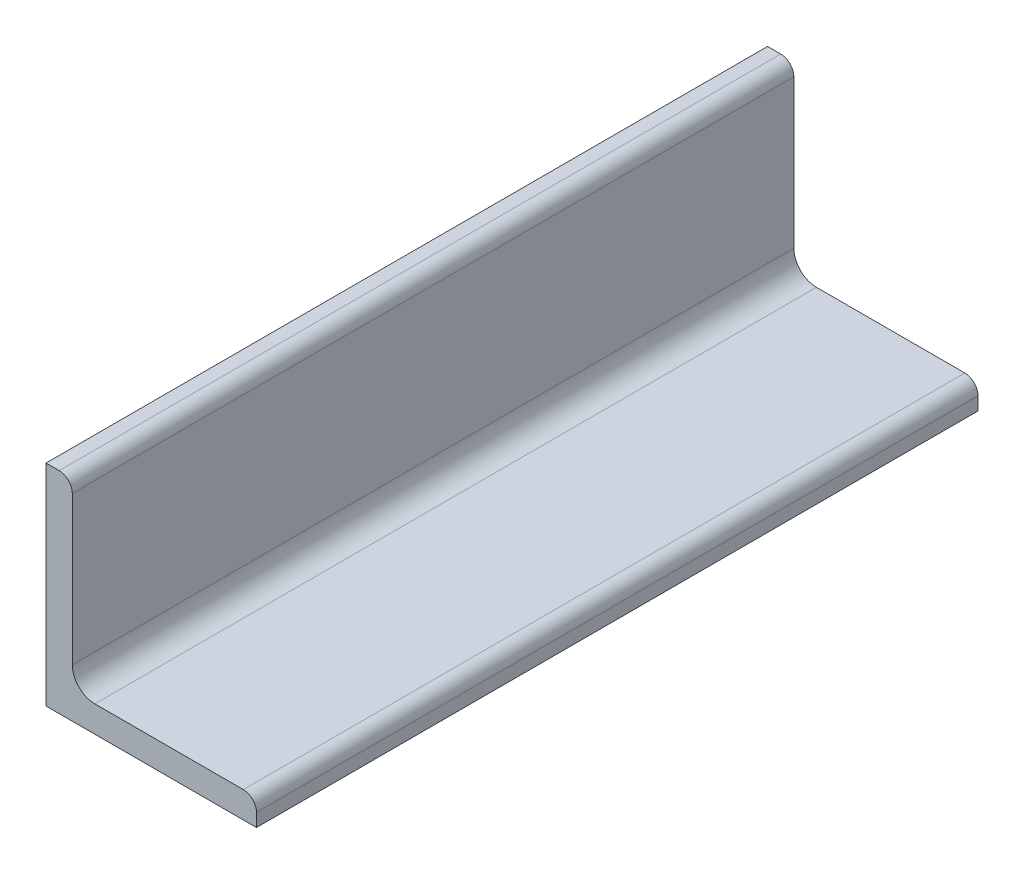
ISO-10303-21;
HEADER;
FILE_DESCRIPTION(('STEP AP214'),'2;1');
FILE_NAME('part.step','',(''),(''),'','','');
FILE_SCHEMA(('AUTOMOTIVE_DESIGN { 1 0 10303 214 1 1 1 1 }'));
ENDSEC;
DATA;
#1=APPLICATION_CONTEXT('core data for automotive mechanical design processes');
#2=APPLICATION_PROTOCOL_DEFINITION('international standard','automotive_design',2000,#1);
#3=PRODUCT_CONTEXT('',#1,'mechanical');
#4=PRODUCT('Part','Part','',(#3));
#5=PRODUCT_RELATED_PRODUCT_CATEGORY('part','',(#4));
#6=PRODUCT_DEFINITION_FORMATION('','',#4);
#7=PRODUCT_DEFINITION_CONTEXT('part definition',#1,'design');
#8=PRODUCT_DEFINITION('design','',#6,#7);
#9=PRODUCT_DEFINITION_SHAPE('','',#8);
#10=(LENGTH_UNIT() NAMED_UNIT(*) SI_UNIT(.MILLI.,.METRE.));
#11=(NAMED_UNIT(*) PLANE_ANGLE_UNIT() SI_UNIT($,.RADIAN.));
#12=(NAMED_UNIT(*) SI_UNIT($,.STERADIAN.) SOLID_ANGLE_UNIT());
#13=UNCERTAINTY_MEASURE_WITH_UNIT(LENGTH_MEASURE(1.E-05),#10,'distance_accuracy_value','');
#14=(GEOMETRIC_REPRESENTATION_CONTEXT(3) GLOBAL_UNCERTAINTY_ASSIGNED_CONTEXT((#13)) GLOBAL_UNIT_ASSIGNED_CONTEXT((#10,
#11,#12)) REPRESENTATION_CONTEXT('',''));
#15=CARTESIAN_POINT('',(0.,0.,0.));
#16=DIRECTION('',(0.,0.,1.));
#17=DIRECTION('',(1.,0.,0.));
#18=AXIS2_PLACEMENT_3D('',#15,#16,#17);
#19=CARTESIAN_POINT('',(0.0836264027816469,89.7372005393545,304.8));
#20=DIRECTION('',(1.,0.,0.));
#21=DIRECTION('',(0.,0.,-1.));
#22=AXIS2_PLACEMENT_3D('',#19,#20,#21);
#23=PLANE('',#22);
#24=DIRECTION('',(0.,-1.,0.));
#25=VECTOR('',#24,1.);
#26=CARTESIAN_POINT('',(0.0836264027816469,89.7372005393545,0.));
#27=LINE('',#26,#25);
#28=CARTESIAN_POINT('',(0.0836264027816469,89.7372005393545,0.));
#29=VERTEX_POINT('',#28);
#30=CARTESIAN_POINT('',(0.0836264027816469,0.837200539354535,0.));
#31=VERTEX_POINT('',#30);
#32=EDGE_CURVE('E135',#29,#31,#27,.T.);
#33=ORIENTED_EDGE('',*,*,#32,.T.);
#34=DIRECTION('',(0.,0.,-1.));
#35=VECTOR('',#34,1.);
#36=CARTESIAN_POINT('',(0.0836264027816469,0.837200539354535,304.8));
#37=LINE('',#36,#35);
#38=CARTESIAN_POINT('',(0.0836264027816469,0.837200539354535,304.8));
#39=VERTEX_POINT('',#38);
#40=EDGE_CURVE('E11',#39,#31,#37,.T.);
#41=ORIENTED_EDGE('',*,*,#40,.F.);
#42=DIRECTION('',(0.,-1.,0.));
#43=VECTOR('',#42,1.);
#44=CARTESIAN_POINT('',(0.0836264027816469,89.7372005393545,304.8));
#45=LINE('',#44,#43);
#46=CARTESIAN_POINT('',(0.0836264027816469,89.7372005393545,304.8));
#47=VERTEX_POINT('',#46);
#48=EDGE_CURVE('E151',#47,#39,#45,.T.);
#49=ORIENTED_EDGE('',*,*,#48,.F.);
#50=DIRECTION('',(0.,0.,-1.));
#51=VECTOR('',#50,1.);
#52=CARTESIAN_POINT('',(0.0836264027816469,89.7372005393545,304.8));
#53=LINE('',#52,#51);
#54=EDGE_CURVE('E131',#47,#29,#53,.T.);
#55=ORIENTED_EDGE('',*,*,#54,.T.);
#56=EDGE_LOOP('',(#33,#41,#49,#55));
#57=FACE_BOUND('',#56,.T.);
#58=ADVANCED_FACE('F33',(#57),#23,.F.);
#59=CARTESIAN_POINT('',(0.0836264027816469,0.837200539354535,304.8));
#60=DIRECTION('',(0.,1.,0.));
#61=DIRECTION('',(0.,0.,1.));
#62=AXIS2_PLACEMENT_3D('',#59,#60,#61);
#63=PLANE('',#62);
#64=DIRECTION('',(1.,0.,0.));
#65=VECTOR('',#64,1.);
#66=CARTESIAN_POINT('',(0.0836264027816469,0.837200539354535,0.));
#67=LINE('',#66,#65);
#68=CARTESIAN_POINT('',(88.9836264027817,0.837200539354535,0.));
#69=VERTEX_POINT('',#68);
#70=EDGE_CURVE('E138',#31,#69,#67,.T.);
#71=ORIENTED_EDGE('',*,*,#70,.T.);
#72=DIRECTION('',(0.,0.,-1.));
#73=VECTOR('',#72,1.);
#74=CARTESIAN_POINT('',(88.9836264027817,0.837200539354535,304.8));
#75=LINE('',#74,#73);
#76=CARTESIAN_POINT('',(88.9836264027817,0.837200539354535,304.8));
#77=VERTEX_POINT('',#76);
#78=EDGE_CURVE('E41',#77,#69,#75,.T.);
#79=ORIENTED_EDGE('',*,*,#78,.F.);
#80=DIRECTION('',(1.,0.,0.));
#81=VECTOR('',#80,1.);
#82=CARTESIAN_POINT('',(0.0836264027816469,0.837200539354535,304.8));
#83=LINE('',#82,#81);
#84=EDGE_CURVE('E95',#39,#77,#83,.T.);
#85=ORIENTED_EDGE('',*,*,#84,.F.);
#86=ORIENTED_EDGE('',*,*,#40,.T.);
#87=EDGE_LOOP('',(#71,#79,#85,#86));
#88=FACE_BOUND('',#87,.T.);
#89=ADVANCED_FACE('F194',(#88),#63,.F.);
#90=CARTESIAN_POINT('',(88.9836264027817,0.837200539354535,304.8));
#91=DIRECTION('',(-1.,0.,0.));
#92=DIRECTION('',(0.,0.,1.));
#93=AXIS2_PLACEMENT_3D('',#90,#91,#92);
#94=PLANE('',#93);
#95=DIRECTION('',(0.,1.,0.));
#96=VECTOR('',#95,1.);
#97=CARTESIAN_POINT('',(88.9836264027817,0.837200539354535,0.));
#98=LINE('',#97,#96);
#99=CARTESIAN_POINT('',(88.9836264027817,6.39345053935453,0.));
#100=VERTEX_POINT('',#99);
#101=EDGE_CURVE('E140',#69,#100,#98,.T.);
#102=ORIENTED_EDGE('',*,*,#101,.T.);
#103=DIRECTION('',(0.,0.,-1.));
#104=VECTOR('',#103,1.);
#105=CARTESIAN_POINT('',(88.9836264027817,6.39345053935453,304.8));
#106=LINE('',#105,#104);
#107=CARTESIAN_POINT('',(88.9836264027817,6.39345053935453,304.8));
#108=VERTEX_POINT('',#107);
#109=EDGE_CURVE('E161',#108,#100,#106,.T.);
#110=ORIENTED_EDGE('',*,*,#109,.F.);
#111=DIRECTION('',(0.,1.,0.));
#112=VECTOR('',#111,1.);
#113=CARTESIAN_POINT('',(88.9836264027817,0.837200539354535,304.8));
#114=LINE('',#113,#112);
#115=EDGE_CURVE('E169',#77,#108,#114,.T.);
#116=ORIENTED_EDGE('',*,*,#115,.F.);
#117=ORIENTED_EDGE('',*,*,#78,.T.);
#118=EDGE_LOOP('',(#102,#110,#116,#117));
#119=FACE_BOUND('',#118,.T.);
#120=ADVANCED_FACE('F167',(#119),#94,.F.);
#121=CARTESIAN_POINT('',(83.4273764027816,6.39345053935453,304.8));
#122=DIRECTION('',(0.,0.,-1.));
#123=DIRECTION('',(-1.,0.,0.));
#124=AXIS2_PLACEMENT_3D('',#121,#122,#123);
#125=CYLINDRICAL_SURFACE('',#124,5.55625000000001);
#126=CARTESIAN_POINT('',(83.4273764027816,6.39345053935453,0.));
#127=DIRECTION('',(0.,0.,1.));
#128=DIRECTION('',(1.,0.,0.));
#129=AXIS2_PLACEMENT_3D('',#126,#127,#128);
#130=CIRCLE('',#129,5.55625000000001);
#131=CARTESIAN_POINT('',(83.4273764027816,11.9497005393545,0.));
#132=VERTEX_POINT('',#131);
#133=EDGE_CURVE('E142',#100,#132,#130,.T.);
#134=ORIENTED_EDGE('',*,*,#133,.T.);
#135=DIRECTION('',(0.,0.,-1.));
#136=VECTOR('',#135,1.);
#137=CARTESIAN_POINT('',(83.4273764027816,11.9497005393545,304.8));
#138=LINE('',#137,#136);
#139=CARTESIAN_POINT('',(83.4273764027816,11.9497005393545,304.8));
#140=VERTEX_POINT('',#139);
#141=EDGE_CURVE('E158',#140,#132,#138,.T.);
#142=ORIENTED_EDGE('',*,*,#141,.F.);
#143=CARTESIAN_POINT('',(83.4273764027816,6.39345053935453,304.8));
#144=DIRECTION('',(0.,0.,1.));
#145=DIRECTION('',(1.,0.,0.));
#146=AXIS2_PLACEMENT_3D('',#143,#144,#145);
#147=CIRCLE('',#146,5.55625000000001);
#148=EDGE_CURVE('E185',#108,#140,#147,.T.);
#149=ORIENTED_EDGE('',*,*,#148,.F.);
#150=ORIENTED_EDGE('',*,*,#109,.T.);
#151=EDGE_LOOP('',(#134,#142,#149,#150));
#152=FACE_BOUND('',#151,.T.);
#153=ADVANCED_FACE('F178',(#152),#125,.T.);
#154=CARTESIAN_POINT('',(83.4273764027816,11.9497005393545,304.8));
#155=DIRECTION('',(0.,-1.,0.));
#156=DIRECTION('',(0.,0.,-1.));
#157=AXIS2_PLACEMENT_3D('',#154,#155,#156);
#158=PLANE('',#157);
#159=DIRECTION('',(-1.,0.,0.));
#160=VECTOR('',#159,1.);
#161=CARTESIAN_POINT('',(83.4273764027816,11.9497005393545,0.));
#162=LINE('',#161,#160);
#163=CARTESIAN_POINT('',(20.7211264027816,11.9497005393545,0.));
#164=VERTEX_POINT('',#163);
#165=EDGE_CURVE('E144',#132,#164,#162,.T.);
#166=ORIENTED_EDGE('',*,*,#165,.T.);
#167=DIRECTION('',(0.,0.,-1.));
#168=VECTOR('',#167,1.);
#169=CARTESIAN_POINT('',(20.7211264027816,11.9497005393545,304.8));
#170=LINE('',#169,#168);
#171=CARTESIAN_POINT('',(20.7211264027816,11.9497005393545,304.8));
#172=VERTEX_POINT('',#171);
#173=EDGE_CURVE('E155',#172,#164,#170,.T.);
#174=ORIENTED_EDGE('',*,*,#173,.F.);
#175=DIRECTION('',(-1.,0.,0.));
#176=VECTOR('',#175,1.);
#177=CARTESIAN_POINT('',(83.4273764027816,11.9497005393545,304.8));
#178=LINE('',#177,#176);
#179=EDGE_CURVE('E184',#140,#172,#178,.T.);
#180=ORIENTED_EDGE('',*,*,#179,.F.);
#181=ORIENTED_EDGE('',*,*,#141,.T.);
#182=EDGE_LOOP('',(#166,#174,#180,#181));
#183=FACE_BOUND('',#182,.T.);
#184=ADVANCED_FACE('F182',(#183),#158,.F.);
#185=CARTESIAN_POINT('',(20.7211264027816,21.4747005393545,304.8));
#186=DIRECTION('',(0.,0.,-1.));
#187=DIRECTION('',(-1.,0.,0.));
#188=AXIS2_PLACEMENT_3D('',#185,#186,#187);
#189=CYLINDRICAL_SURFACE('',#188,9.52499999999999);
#190=CARTESIAN_POINT('',(20.7211264027816,21.4747005393545,0.));
#191=DIRECTION('',(0.,0.,-1.));
#192=DIRECTION('',(1.,0.,0.));
#193=AXIS2_PLACEMENT_3D('',#190,#191,#192);
#194=CIRCLE('',#193,9.52499999999999);
#195=CARTESIAN_POINT('',(11.1961264027816,21.4747005393545,0.));
#196=VERTEX_POINT('',#195);
#197=EDGE_CURVE('E146',#164,#196,#194,.T.);
#198=ORIENTED_EDGE('',*,*,#197,.T.);
#199=DIRECTION('',(0.,0.,-1.));
#200=VECTOR('',#199,1.);
#201=CARTESIAN_POINT('',(11.1961264027816,21.4747005393545,304.8));
#202=LINE('',#201,#200);
#203=CARTESIAN_POINT('',(11.1961264027816,21.4747005393545,304.8));
#204=VERTEX_POINT('',#203);
#205=EDGE_CURVE('E126',#204,#196,#202,.T.);
#206=ORIENTED_EDGE('',*,*,#205,.F.);
#207=CARTESIAN_POINT('',(20.7211264027816,21.4747005393545,304.8));
#208=DIRECTION('',(0.,0.,-1.));
#209=DIRECTION('',(1.,0.,0.));
#210=AXIS2_PLACEMENT_3D('',#207,#208,#209);
#211=CIRCLE('',#210,9.52499999999999);
#212=EDGE_CURVE('E117',#172,#204,#211,.T.);
#213=ORIENTED_EDGE('',*,*,#212,.F.);
#214=ORIENTED_EDGE('',*,*,#173,.T.);
#215=EDGE_LOOP('',(#198,#206,#213,#214));
#216=FACE_BOUND('',#215,.T.);
#217=ADVANCED_FACE('F206',(#216),#189,.F.);
#218=CARTESIAN_POINT('',(11.1961264027816,21.4747005393545,304.8));
#219=DIRECTION('',(-1.,0.,0.));
#220=DIRECTION('',(0.,0.,1.));
#221=AXIS2_PLACEMENT_3D('',#218,#219,#220);
#222=PLANE('',#221);
#223=DIRECTION('',(0.,1.,0.));
#224=VECTOR('',#223,1.);
#225=CARTESIAN_POINT('',(11.1961264027816,21.4747005393545,0.));
#226=LINE('',#225,#224);
#227=CARTESIAN_POINT('',(11.1961264027816,84.1809505393545,0.));
#228=VERTEX_POINT('',#227);
#229=EDGE_CURVE('E125',#196,#228,#226,.T.);
#230=ORIENTED_EDGE('',*,*,#229,.T.);
#231=DIRECTION('',(0.,0.,-1.));
#232=VECTOR('',#231,1.);
#233=CARTESIAN_POINT('',(11.1961264027816,84.1809505393545,304.8));
#234=LINE('',#233,#232);
#235=CARTESIAN_POINT('',(11.1961264027816,84.1809505393545,304.8));
#236=VERTEX_POINT('',#235);
#237=EDGE_CURVE('E122',#236,#228,#234,.T.);
#238=ORIENTED_EDGE('',*,*,#237,.F.);
#239=DIRECTION('',(0.,1.,0.));
#240=VECTOR('',#239,1.);
#241=CARTESIAN_POINT('',(11.1961264027816,21.4747005393545,304.8));
#242=LINE('',#241,#240);
#243=EDGE_CURVE('E111',#204,#236,#242,.T.);
#244=ORIENTED_EDGE('',*,*,#243,.F.);
#245=ORIENTED_EDGE('',*,*,#205,.T.);
#246=EDGE_LOOP('',(#230,#238,#244,#245));
#247=FACE_BOUND('',#246,.T.);
#248=ADVANCED_FACE('F123',(#247),#222,.F.);
#249=CARTESIAN_POINT('',(5.63987640278164,84.1809505393545,304.8));
#250=DIRECTION('',(0.,0.,-1.));
#251=DIRECTION('',(-1.,0.,0.));
#252=AXIS2_PLACEMENT_3D('',#249,#250,#251);
#253=CYLINDRICAL_SURFACE('',#252,5.55625000000001);
#254=CARTESIAN_POINT('',(5.63987640278164,84.1809505393545,0.));
#255=DIRECTION('',(0.,0.,1.));
#256=DIRECTION('',(1.,0.,0.));
#257=AXIS2_PLACEMENT_3D('',#254,#255,#256);
#258=CIRCLE('',#257,5.55625000000001);
#259=CARTESIAN_POINT('',(5.63987640278165,89.7372005393545,0.));
#260=VERTEX_POINT('',#259);
#261=EDGE_CURVE('E81',#228,#260,#258,.T.);
#262=ORIENTED_EDGE('',*,*,#261,.T.);
#263=DIRECTION('',(0.,0.,-1.));
#264=VECTOR('',#263,1.);
#265=CARTESIAN_POINT('',(5.63987640278165,89.7372005393545,304.8));
#266=LINE('',#265,#264);
#267=CARTESIAN_POINT('',(5.63987640278165,89.7372005393545,304.8));
#268=VERTEX_POINT('',#267);
#269=EDGE_CURVE('E127',#268,#260,#266,.T.);
#270=ORIENTED_EDGE('',*,*,#269,.F.);
#271=CARTESIAN_POINT('',(5.63987640278164,84.1809505393545,304.8));
#272=DIRECTION('',(0.,0.,1.));
#273=DIRECTION('',(1.,0.,0.));
#274=AXIS2_PLACEMENT_3D('',#271,#272,#273);
#275=CIRCLE('',#274,5.55625000000001);
#276=EDGE_CURVE('E115',#236,#268,#275,.T.);
#277=ORIENTED_EDGE('',*,*,#276,.F.);
#278=ORIENTED_EDGE('',*,*,#237,.T.);
#279=EDGE_LOOP('',(#262,#270,#277,#278));
#280=FACE_BOUND('',#279,.T.);
#281=ADVANCED_FACE('F129',(#280),#253,.T.);
#282=CARTESIAN_POINT('',(5.63987640278165,89.7372005393545,304.8));
#283=DIRECTION('',(0.,-1.,0.));
#284=DIRECTION('',(0.,0.,-1.));
#285=AXIS2_PLACEMENT_3D('',#282,#283,#284);
#286=PLANE('',#285);
#287=DIRECTION('',(-1.,0.,0.));
#288=VECTOR('',#287,1.);
#289=CARTESIAN_POINT('',(5.63987640278165,89.7372005393545,0.));
#290=LINE('',#289,#288);
#291=EDGE_CURVE('E87',#260,#29,#290,.T.);
#292=ORIENTED_EDGE('',*,*,#291,.T.);
#293=ORIENTED_EDGE('',*,*,#54,.F.);
#294=DIRECTION('',(-1.,0.,0.));
#295=VECTOR('',#294,1.);
#296=CARTESIAN_POINT('',(5.63987640278165,89.7372005393545,304.8));
#297=LINE('',#296,#295);
#298=EDGE_CURVE('E49',#268,#47,#297,.T.);
#299=ORIENTED_EDGE('',*,*,#298,.F.);
#300=ORIENTED_EDGE('',*,*,#269,.T.);
#301=EDGE_LOOP('',(#292,#293,#299,#300));
#302=FACE_BOUND('',#301,.T.);
#303=ADVANCED_FACE('F214',(#302),#286,.F.);
#304=CARTESIAN_POINT('',(83.4273764027816,6.39345053935453,304.8));
#305=DIRECTION('',(0.,0.,1.));
#306=DIRECTION('',(1.,0.,0.));
#307=AXIS2_PLACEMENT_3D('',#304,#305,#306);
#308=PLANE('',#307);
#309=ORIENTED_EDGE('',*,*,#48,.T.);
#310=ORIENTED_EDGE('',*,*,#84,.T.);
#311=ORIENTED_EDGE('',*,*,#115,.T.);
#312=ORIENTED_EDGE('',*,*,#148,.T.);
#313=ORIENTED_EDGE('',*,*,#179,.T.);
#314=ORIENTED_EDGE('',*,*,#212,.T.);
#315=ORIENTED_EDGE('',*,*,#243,.T.);
#316=ORIENTED_EDGE('',*,*,#276,.T.);
#317=ORIENTED_EDGE('',*,*,#298,.T.);
#318=EDGE_LOOP('',(#309,#310,#311,#312,#313,#314,#315,#316,#317));
#319=FACE_BOUND('',#318,.T.);
#320=ADVANCED_FACE('F113',(#319),#308,.T.);
#321=CARTESIAN_POINT('',(83.4273764027816,6.39345053935453,0.));
#322=DIRECTION('',(0.,0.,1.));
#323=DIRECTION('',(1.,0.,0.));
#324=AXIS2_PLACEMENT_3D('',#321,#322,#323);
#325=PLANE('',#324);
#326=ORIENTED_EDGE('',*,*,#32,.F.);
#327=ORIENTED_EDGE('',*,*,#291,.F.);
#328=ORIENTED_EDGE('',*,*,#261,.F.);
#329=ORIENTED_EDGE('',*,*,#229,.F.);
#330=ORIENTED_EDGE('',*,*,#197,.F.);
#331=ORIENTED_EDGE('',*,*,#165,.F.);
#332=ORIENTED_EDGE('',*,*,#133,.F.);
#333=ORIENTED_EDGE('',*,*,#101,.F.);
#334=ORIENTED_EDGE('',*,*,#70,.F.);
#335=EDGE_LOOP('',(#326,#327,#328,#329,#330,#331,#332,#333,#334));
#336=FACE_BOUND('',#335,.T.);
#337=ADVANCED_FACE('F173',(#336),#325,.F.);
#338=CLOSED_SHELL('',(#58,#89,#120,#153,#184,#217,#248,#281,#303,#320,#337));
#339=MANIFOLD_SOLID_BREP('B2',#338);
#340=ADVANCED_BREP_SHAPE_REPRESENTATION('',(#18,#339),#14);
#341=SHAPE_DEFINITION_REPRESENTATION(#9,#340);
ENDSEC;
END-ISO-10303-21;
